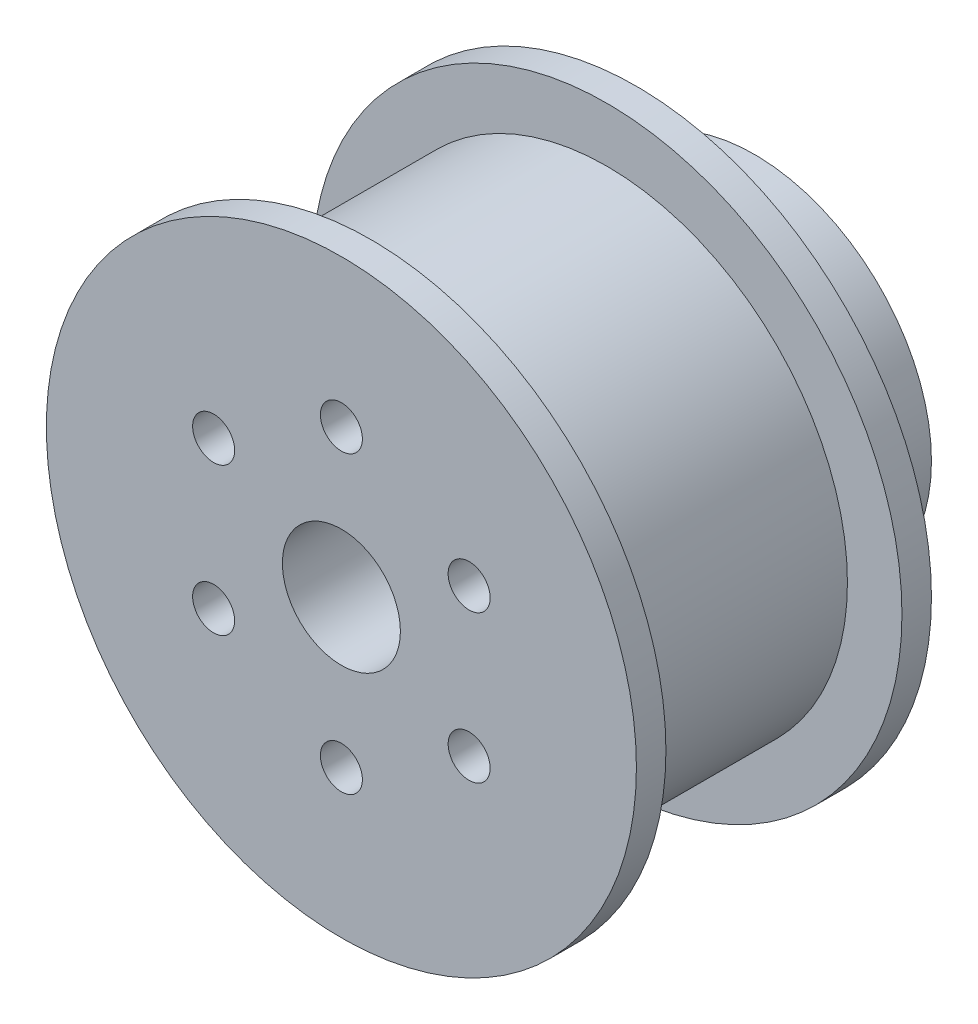
ISO-10303-21;
HEADER;
FILE_DESCRIPTION(('STEP AP214'),'2;1');
FILE_NAME('part.step','',(''),(''),'','','');
FILE_SCHEMA(('AUTOMOTIVE_DESIGN { 1 0 10303 214 1 1 1 1 }'));
ENDSEC;
DATA;
#1=APPLICATION_CONTEXT('core data for automotive mechanical design processes');
#2=APPLICATION_PROTOCOL_DEFINITION('international standard','automotive_design',2000,#1);
#3=PRODUCT_CONTEXT('',#1,'mechanical');
#4=PRODUCT('Part','Part','',(#3));
#5=PRODUCT_RELATED_PRODUCT_CATEGORY('part','',(#4));
#6=PRODUCT_DEFINITION_FORMATION('','',#4);
#7=PRODUCT_DEFINITION_CONTEXT('part definition',#1,'design');
#8=PRODUCT_DEFINITION('design','',#6,#7);
#9=PRODUCT_DEFINITION_SHAPE('','',#8);
#10=(LENGTH_UNIT() NAMED_UNIT(*) SI_UNIT(.MILLI.,.METRE.));
#11=(NAMED_UNIT(*) PLANE_ANGLE_UNIT() SI_UNIT($,.RADIAN.));
#12=(NAMED_UNIT(*) SI_UNIT($,.STERADIAN.) SOLID_ANGLE_UNIT());
#13=UNCERTAINTY_MEASURE_WITH_UNIT(LENGTH_MEASURE(1.E-05),#10,'distance_accuracy_value','');
#14=(GEOMETRIC_REPRESENTATION_CONTEXT(3) GLOBAL_UNCERTAINTY_ASSIGNED_CONTEXT((#13)) GLOBAL_UNIT_ASSIGNED_CONTEXT((#10,
#11,#12)) REPRESENTATION_CONTEXT('',''));
#15=CARTESIAN_POINT('',(0.,0.,0.));
#16=DIRECTION('',(0.,0.,1.));
#17=DIRECTION('',(1.,0.,0.));
#18=AXIS2_PLACEMENT_3D('',#15,#16,#17);
#19=CARTESIAN_POINT('',(0.,0.,0.));
#20=DIRECTION('',(0.,0.,-1.));
#21=DIRECTION('',(1.,0.,0.));
#22=AXIS2_PLACEMENT_3D('',#19,#20,#21);
#23=CYLINDRICAL_SURFACE('',#22,9.525);
#24=CARTESIAN_POINT('',(0.,9.525,2.04470000000001));
#25=CARTESIAN_POINT('',(-0.0632509375219131,9.52499915479188,2.04470270245697));
#26=CARTESIAN_POINT('',(-0.126542029749757,9.5243633064193,2.0500271232438));
#27=CARTESIAN_POINT('',(-0.251364820472078,9.52188793721448,2.07118424036684));
#28=CARTESIAN_POINT('',(-0.312894581904219,9.52004714057458,2.08702807498671));
#29=CARTESIAN_POINT('',(-0.432369436874992,9.51536936505536,2.12875218330424));
#30=CARTESIAN_POINT('',(-0.49031684700516,9.51253303804938,2.1546258905958));
#31=CARTESIAN_POINT('',(-0.601035404846345,9.506180121912,2.2156613468546));
#32=CARTESIAN_POINT('',(-0.653807476710619,9.50266365456691,2.25082143340901));
#33=CARTESIAN_POINT('',(-0.75295182295395,9.49532382723018,2.32961909895453));
#34=CARTESIAN_POINT('',(-0.799294604149035,9.49149917244225,2.37329366976166));
#35=CARTESIAN_POINT('',(-0.884010990406446,9.48398454417843,2.46780121878827));
#36=CARTESIAN_POINT('',(-0.922384200022101,9.48029457739318,2.5186345520125));
#37=CARTESIAN_POINT('',(-0.990180703567408,9.47345427413314,2.62620658516361));
#38=CARTESIAN_POINT('',(-1.01957659957805,9.47030560217059,2.68296266738078));
#39=CARTESIAN_POINT('',(-1.06840907808638,9.46492124661159,2.80064933068694));
#40=CARTESIAN_POINT('',(-1.08784600183097,9.46268553173297,2.86157976865938));
#41=CARTESIAN_POINT('',(-1.1161197035534,9.45939245018979,2.98558067429048));
#42=CARTESIAN_POINT('',(-1.12500607633105,9.45832957207026,3.04863968484435));
#43=CARTESIAN_POINT('',(-1.13207984575786,9.45748558744171,3.17536229799693));
#44=CARTESIAN_POINT('',(-1.13026763163491,9.45770443430195,3.23902587851649));
#45=CARTESIAN_POINT('',(-1.11603642445577,9.45939413033264,3.36480585863814));
#46=CARTESIAN_POINT('',(-1.10367192939602,9.4608585465419,3.42692852300703));
#47=CARTESIAN_POINT('',(-1.06877210956582,9.46486434331535,3.54821086751916));
#48=CARTESIAN_POINT('',(-1.04623659739191,9.4674057437232,3.6073704930454));
#49=CARTESIAN_POINT('',(-0.991575435750873,9.47328648500057,3.72121752193824));
#50=CARTESIAN_POINT('',(-0.959425968133554,9.47662780348318,3.77589338322514));
#51=CARTESIAN_POINT('',(-0.886466559501061,9.48373033604865,3.87909440846158));
#52=CARTESIAN_POINT('',(-0.845656261347889,9.48749156744401,3.92761931863866));
#53=CARTESIAN_POINT('',(-0.756230970668207,9.49503875161689,4.01745742183581));
#54=CARTESIAN_POINT('',(-0.707568978368593,9.49882471254411,4.05872384478604));
#55=CARTESIAN_POINT('',(-0.603983835638156,9.5059728190733,4.13250986554822));
#56=CARTESIAN_POINT('',(-0.549060673090109,9.50933496385503,4.16502944643204));
#57=CARTESIAN_POINT('',(-0.434477192227891,9.51525841591306,4.22039818128805));
#58=CARTESIAN_POINT('',(-0.37481551982548,9.51781949323438,4.24324455912828));
#59=CARTESIAN_POINT('',(-0.252465658532567,9.52185010274536,4.27858201850423));
#60=CARTESIAN_POINT('',(-0.18977759738165,9.52331968096283,4.29107353670023));
#61=CARTESIAN_POINT('',(-0.0635590107666499,9.52499574893122,4.30528642309018));
#62=CARTESIAN_POINT('',(-3.58400083123205E-05,9.52520979797053,4.30707224953617));
#63=CARTESIAN_POINT('',(0.126404631849714,9.5243710616825,4.29999294412866));
#64=CARTESIAN_POINT('',(0.189321944527945,9.52331830061377,4.29112801623034));
#65=CARTESIAN_POINT('',(0.312575650423429,9.52006897220777,4.26305237506707));
#66=CARTESIAN_POINT('',(0.372919106821373,9.51787578670261,4.24387224492876));
#67=CARTESIAN_POINT('',(0.489532754276605,9.51259128030109,4.19574234807837));
#68=CARTESIAN_POINT('',(0.545802819522162,9.50949993167863,4.16679227976586));
#69=CARTESIAN_POINT('',(0.652961239170924,9.50274519697551,4.09978727203576));
#70=CARTESIAN_POINT('',(0.703823242482478,9.49907920769755,4.06169045722993));
#71=CARTESIAN_POINT('',(0.798454027403533,9.49159384532421,3.97753284488347));
#72=CARTESIAN_POINT('',(0.842222556073248,9.48777446676533,3.93147176347326));
#73=CARTESIAN_POINT('',(0.921651327981493,9.48038962493189,3.83240990885744));
#74=CARTESIAN_POINT('',(0.957268957312501,9.47682556018668,3.77937484808917));
#75=CARTESIAN_POINT('',(1.01909088187736,9.47037744686408,3.66803762953532));
#76=CARTESIAN_POINT('',(1.04529534989561,9.46749338580514,3.60973556845337));
#77=CARTESIAN_POINT('',(1.08747746493127,9.46274116392142,3.48965919026062));
#78=CARTESIAN_POINT('',(1.10347950086257,9.46087058199655,3.42789354070565));
#79=CARTESIAN_POINT('',(1.12488122562179,9.45835002776142,3.30252837334878));
#80=CARTESIAN_POINT('',(1.13028135522926,9.45770000470587,3.23892893189927));
#81=CARTESIAN_POINT('',(1.1303184331302,9.45769553968786,3.11212535749611));
#82=CARTESIAN_POINT('',(1.12502232452988,9.45833303967828,3.04892123389645));
#83=CARTESIAN_POINT('',(1.10395863981905,9.46081450631757,2.92430798622455));
#84=CARTESIAN_POINT('',(1.08819105929352,9.46265847347512,2.86289886290915));
#85=CARTESIAN_POINT('',(1.04665229311139,9.4673426850713,2.74362536688638));
#86=CARTESIAN_POINT('',(1.02088399489125,9.4701826419221,2.68575997660022));
#87=CARTESIAN_POINT('',(0.960081888687952,9.47653934827966,2.57516402600584));
#88=CARTESIAN_POINT('',(0.925048010140116,9.48005610294073,2.52243350480786));
#89=CARTESIAN_POINT('',(0.846459876445609,9.4873965412942,2.42326157372525));
#90=CARTESIAN_POINT('',(0.802855698093828,9.49122194198921,2.37685984993572));
#91=CARTESIAN_POINT('',(0.70846795098953,9.49873331929354,2.29200565583022));
#92=CARTESIAN_POINT('',(0.657682685184867,9.50241926268422,2.25355506985088));
#93=CARTESIAN_POINT('',(0.550175875241665,9.50925025151029,2.18558383753544));
#94=CARTESIAN_POINT('',(0.493434507280822,9.51239339223359,2.1560943717792));
#95=CARTESIAN_POINT('',(0.375800731512535,9.51776504462355,2.10710365534466));
#96=CARTESIAN_POINT('',(0.314912964671015,9.51999455988771,2.08759143900469));
#97=CARTESIAN_POINT('',(0.21141811479381,9.5227440281588,2.06383345788656));
#98=CARTESIAN_POINT('',(0.169466299617015,9.52358594491639,2.05666858193351));
#99=CARTESIAN_POINT('',(0.0850157018599232,9.524714213129,2.04710095996014));
#100=CARTESIAN_POINT('',(0.0425169227863941,9.52500056814412,2.0446981834237));
#101=CARTESIAN_POINT('',(0.,9.525,2.04470000000001));
#102=B_SPLINE_CURVE_WITH_KNOTS('',3,(#24,#25,#26,#27,#28,#29,#30,#31,#32,#33,#34,#35,#36,#37,
#38,#39,#40,#41,#42,#43,#44,#45,#46,#47,#48,#49,#50,#51,#52,#53,#54,#55,#56,#57,#58,#59,#60,#61,
#62,#63,#64,#65,#66,#67,#68,#69,#70,#71,#72,#73,#74,#75,#76,#77,#78,#79,#80,#81,#82,#83,#84,#85,
#86,#87,#88,#89,#90,#91,#92,#93,#94,#95,#96,#97,#98,#99,#100,#101),.UNSPECIFIED.,.T.,.F.,(4,2,2,
2,2,2,2,2,2,2,2,2,2,2,2,2,2,2,2,2,2,2,2,2,2,2,2,2,2,2,2,2,2,2,2,2,2,2,4),(0.,0.189597524312163,
0.379396121234883,0.569070669169938,0.758711285265448,0.949194948105548,1.13968806040505,
1.33075686013228,1.52181911239724,1.71197964005891,1.90213324948718,2.09131069927981,
2.28049163485501,2.4701451964838,2.65980658018673,2.8506485273792,3.04149084391374,
3.232387893604,3.4232768928326,3.61301539850875,3.80275027087081,3.99192568241037,
4.18110693437604,4.37117138460746,4.56124261068453,4.75228593782411,4.94332575806604,
5.13390716820241,5.32448065465381,5.51386512071868,5.70324966663245,5.89257957351563,
6.08191092233625,6.27237971236643,6.4628935899097,6.65406297150348,6.8450217911509,
6.97246899232318,7.09991537679581),.UNSPECIFIED.);
#103=CARTESIAN_POINT('',(0.,9.525,2.04470000000001));
#104=VERTEX_POINT('',#103);
#105=EDGE_CURVE('E85',#104,#104,#102,.T.);
#106=ORIENTED_EDGE('',*,*,#105,.F.);
#107=EDGE_LOOP('',(#106));
#108=FACE_BOUND('',#107,.T.);
#109=CARTESIAN_POINT('',(0.,0.,0.));
#110=DIRECTION('',(0.,0.,1.));
#111=DIRECTION('',(1.,0.,0.));
#112=AXIS2_PLACEMENT_3D('',#109,#110,#111);
#113=CIRCLE('',#112,9.525);
#114=CARTESIAN_POINT('',(9.525,0.,0.));
#115=VERTEX_POINT('',#114);
#116=EDGE_CURVE('E11',#115,#115,#113,.T.);
#117=ORIENTED_EDGE('',*,*,#116,.T.);
#118=EDGE_LOOP('',(#117));
#119=FACE_BOUND('',#118,.T.);
#120=CARTESIAN_POINT('',(0.,0.,6.35));
#121=DIRECTION('',(0.,0.,1.));
#122=DIRECTION('',(1.,0.,0.));
#123=AXIS2_PLACEMENT_3D('',#120,#121,#122);
#124=CIRCLE('',#123,9.525);
#125=CARTESIAN_POINT('',(9.525,0.,6.35));
#126=VERTEX_POINT('',#125);
#127=EDGE_CURVE('E115',#126,#126,#124,.T.);
#128=ORIENTED_EDGE('',*,*,#127,.F.);
#129=EDGE_LOOP('',(#128));
#130=FACE_BOUND('',#129,.T.);
#131=ADVANCED_FACE('F41',(#108,#119,#130),#23,.T.);
#132=CARTESIAN_POINT('',(0.,9.525,0.));
#133=DIRECTION('',(0.,0.,1.));
#134=DIRECTION('',(-1.,0.,0.));
#135=AXIS2_PLACEMENT_3D('',#132,#133,#134);
#136=PLANE('',#135);
#137=CARTESIAN_POINT('',(0.,0.,0.));
#138=DIRECTION('',(0.,0.,1.));
#139=DIRECTION('',(1.,0.,0.));
#140=AXIS2_PLACEMENT_3D('',#137,#138,#139);
#141=CIRCLE('',#140,3.175);
#142=CARTESIAN_POINT('',(3.175,0.,0.));
#143=VERTEX_POINT('',#142);
#144=EDGE_CURVE('E49',#143,#143,#141,.T.);
#145=ORIENTED_EDGE('',*,*,#144,.T.);
#146=EDGE_LOOP('',(#145));
#147=FACE_BOUND('',#146,.T.);
#148=ORIENTED_EDGE('',*,*,#116,.F.);
#149=EDGE_LOOP('',(#148));
#150=FACE_BOUND('',#149,.T.);
#151=ADVANCED_FACE('F141',(#147,#150),#136,.F.);
#152=CARTESIAN_POINT('',(0.,0.,0.));
#153=DIRECTION('',(0.,0.,-1.));
#154=DIRECTION('',(1.,0.,0.));
#155=AXIS2_PLACEMENT_3D('',#152,#153,#154);
#156=CYLINDRICAL_SURFACE('',#155,3.175);
#157=CARTESIAN_POINT('',(0.,3.175,2.04470000000001));
#158=CARTESIAN_POINT('',(0.0614285544766775,3.17500087649076,2.04469877624258));
#159=CARTESIAN_POINT('',(0.122848391480887,3.17320130070143,2.04972367898314));
#160=CARTESIAN_POINT('',(0.243864611742384,3.1662010034201,2.06961858543575));
#161=CARTESIAN_POINT('',(0.303461052111786,3.16100038856924,2.08448828045996));
#162=CARTESIAN_POINT('',(0.419068309151045,3.14775949893737,2.12348844997215));
#163=CARTESIAN_POINT('',(0.475085403185974,3.13972436624609,2.14760216174167));
#164=CARTESIAN_POINT('',(0.582278041616503,3.12162393487057,2.20432504012241));
#165=CARTESIAN_POINT('',(0.63345243149865,3.11155815385673,2.23693622563318));
#166=CARTESIAN_POINT('',(0.731495005230027,3.09000790855595,2.31105507992649));
#167=CARTESIAN_POINT('',(0.778149616243894,3.07848610582585,2.35283431689856));
#168=CARTESIAN_POINT('',(0.863958107942655,3.055516031792,2.44352654130838));
#169=CARTESIAN_POINT('',(0.903110009958687,3.04406778065305,2.49244140463129));
#170=CARTESIAN_POINT('',(0.974093633832353,3.02211785986225,2.59802569017699));
#171=CARTESIAN_POINT('',(1.00563502809096,3.01166094904186,2.65490051833327));
#172=CARTESIAN_POINT('',(1.05861134705909,2.99345244738711,2.77357939759986));
#173=CARTESIAN_POINT('',(1.08004985661479,2.98569989720789,2.8353816911635));
#174=CARTESIAN_POINT('',(1.11138819305282,2.9741742173714,2.9597149448491));
#175=CARTESIAN_POINT('',(1.12169236541681,2.97026214805179,3.0221306997839));
#176=CARTESIAN_POINT('',(1.13173392893204,2.96645158379256,3.14791847859527));
#177=CARTESIAN_POINT('',(1.13147514856466,2.96655163468287,3.21129014768161));
#178=CARTESIAN_POINT('',(1.12070953557278,2.97063328242024,3.3336133661018));
#179=CARTESIAN_POINT('',(1.11074743190181,2.9744085523292,3.39262097911382));
#180=CARTESIAN_POINT('',(1.08175290027524,2.98507483987672,3.50806464240935));
#181=CARTESIAN_POINT('',(1.06271924100947,2.99196628047622,3.56450034245956));
#182=CARTESIAN_POINT('',(1.01579639288465,3.00822311818093,3.67436762329595));
#183=CARTESIAN_POINT('',(0.98775662564137,3.01763009039322,3.72772847353732));
#184=CARTESIAN_POINT('',(0.923722187948481,3.03784253722577,3.82915226072601));
#185=CARTESIAN_POINT('',(0.887724971743376,3.04864845893998,3.87721349482272));
#186=CARTESIAN_POINT('',(0.806247147627662,3.0712342285018,3.96971122491127));
#187=CARTESIAN_POINT('',(0.760326653485437,3.08303358094073,4.01375635543315));
#188=CARTESIAN_POINT('',(0.661610098844965,3.10571393948941,4.09363040690295));
#189=CARTESIAN_POINT('',(0.608813181467748,3.11659483086972,4.12945830235303));
#190=CARTESIAN_POINT('',(0.496923650490418,3.13639217173446,4.19225643876642));
#191=CARTESIAN_POINT('',(0.437759573781156,3.14528190725224,4.21910836273788));
#192=CARTESIAN_POINT('',(0.31535998984196,3.15989936928577,4.2623520019204));
#193=CARTESIAN_POINT('',(0.252126116160288,3.16562835574328,4.27874788553834));
#194=CARTESIAN_POINT('',(0.126684885961714,3.17306329879329,4.29988948929031));
#195=CARTESIAN_POINT('',(0.0645771816882159,3.17495136824996,4.30516304433809));
#196=CARTESIAN_POINT('',(-0.0596565359676966,3.17504672531149,4.30543160042332));
#197=CARTESIAN_POINT('',(-0.121782543364872,3.1732547352019,4.30042861843736));
#198=CARTESIAN_POINT('',(-0.2420876895595,3.16631168752833,4.28069555255756));
#199=CARTESIAN_POINT('',(-0.300329231110409,3.16127656517542,4.26630097687732));
#200=CARTESIAN_POINT('',(-0.413538192846497,3.14846933320479,4.22862458392996));
#201=CARTESIAN_POINT('',(-0.468505187040125,3.14069686838655,4.20534161326216));
#202=CARTESIAN_POINT('',(-0.575332725471089,3.12292068057346,4.14983109763225));
#203=CARTESIAN_POINT('',(-0.62706241789348,3.11286035066926,4.11737039982098));
#204=CARTESIAN_POINT('',(-0.724505279210258,3.09163517782237,4.04469392625775));
#205=CARTESIAN_POINT('',(-0.770216385550679,3.08046995852105,4.00447550353221));
#206=CARTESIAN_POINT('',(-0.856811848575496,3.05754963314883,3.91495158635895));
#207=CARTESIAN_POINT('',(-0.897320261231916,3.0457941243994,3.86528162488484));
#208=CARTESIAN_POINT('',(-0.96948829647317,3.02359841598846,3.75960588734371));
#209=CARTESIAN_POINT('',(-1.00114750732455,3.01315827754059,3.70359981664202));
#210=CARTESIAN_POINT('',(-1.05465477079429,2.99485112677041,3.58660726309193));
#211=CARTESIAN_POINT('',(-1.07649405053023,2.98698641696941,3.52561638418745));
#212=CARTESIAN_POINT('',(-1.10946944902859,2.97489781303426,3.40047036605966));
#213=CARTESIAN_POINT('',(-1.12061131703489,2.97067196334806,3.33631694603455));
#214=CARTESIAN_POINT('',(-1.13139068963521,2.96658222044346,3.21069434395218));
#215=CARTESIAN_POINT('',(-1.13166111008652,2.9664783574786,3.14928675952382));
#216=CARTESIAN_POINT('',(-1.12228164306422,2.97003931415379,3.02735111764559));
#217=CARTESIAN_POINT('',(-1.1126325176599,2.97370384428697,2.96682299299347));
#218=CARTESIAN_POINT('',(-1.08416089230554,2.98419839475886,2.84987294880746));
#219=CARTESIAN_POINT('',(-1.06557142470546,2.9909477964968,2.79338646868559));
#220=CARTESIAN_POINT('',(-1.01994372799953,3.0068123311106,2.68429540767603));
#221=CARTESIAN_POINT('',(-0.992903472899541,3.01592803119462,2.63169176140234));
#222=CARTESIAN_POINT('',(-0.929616151238455,3.03604854272464,2.52909051132457));
#223=CARTESIAN_POINT('',(-0.892986233526769,3.0471235224069,2.4793429511517));
#224=CARTESIAN_POINT('',(-0.812177154252531,3.06964995874745,2.38649729256409));
#225=CARTESIAN_POINT('',(-0.767995717285472,3.08110152803636,2.34340120582446));
#226=CARTESIAN_POINT('',(-0.670861718733724,3.10373428576573,2.26303642120086));
#227=CARTESIAN_POINT('',(-0.617595515492274,3.11487776157142,2.22613466782598));
#228=CARTESIAN_POINT('',(-0.505234578584043,3.13506244460878,2.16183451178947));
#229=CARTESIAN_POINT('',(-0.446140340356561,3.14410383031939,2.13443530221262));
#230=CARTESIAN_POINT('',(-0.323645197027847,3.15906443826106,2.09006649917454));
#231=CARTESIAN_POINT('',(-0.260236860921374,3.16497811106267,2.07311543486654));
#232=CARTESIAN_POINT('',(-0.13121513161262,3.17294468299437,2.05043499228508));
#233=CARTESIAN_POINT('',(-0.0656025945972242,3.17499906395212,2.04470130691115));
#234=CARTESIAN_POINT('',(0.,3.175,2.04470000000001));
#235=B_SPLINE_CURVE_WITH_KNOTS('',3,(#157,#158,#159,#160,#161,#162,#163,#164,#165,#166,#167,
#168,#169,#170,#171,#172,#173,#174,#175,#176,#177,#178,#179,#180,#181,#182,#183,#184,#185,#186,
#187,#188,#189,#190,#191,#192,#193,#194,#195,#196,#197,#198,#199,#200,#201,#202,#203,#204,#205,
#206,#207,#208,#209,#210,#211,#212,#213,#214,#215,#216,#217,#218,#219,#220,#221,#222,#223,#224,
#225,#226,#227,#228,#229,#230,#231,#232,#233,#234),.UNSPECIFIED.,.T.,.F.,(4,2,2,2,2,2,2,2,2,2,2,
2,2,2,2,2,2,2,2,2,2,2,2,2,2,2,2,2,2,2,2,2,2,2,2,2,2,2,4),(0.,0.184043941459559,
0.368082112412804,0.55178812280708,0.735537819443362,0.925722644883201,1.11595755842548,
1.31258758821647,1.50914779437034,1.69830149435246,1.88738663727475,2.0664345293368,
2.24550673104464,2.42774410221585,2.61003985955345,2.80329006106036,2.99656436677722,
3.19229416831943,3.38794589132548,3.57408187032766,3.76018131989989,3.93997181359126,
4.11978564569257,4.30465683345394,4.48959121210527,4.68416822385534,4.87875428732968,
5.07351384543876,5.26816867279114,5.45147357003616,5.63476438593101,5.81351722268546,
5.99231294661073,6.17977826003498,6.36730015993199,6.56359488860402,6.75987294468711,
6.95649809396628,7.15304773089825),.UNSPECIFIED.);
#236=CARTESIAN_POINT('',(0.,3.175,2.04470000000001));
#237=VERTEX_POINT('',#236);
#238=EDGE_CURVE('E253',#237,#237,#235,.T.);
#239=ORIENTED_EDGE('',*,*,#238,.F.);
#240=EDGE_LOOP('',(#239));
#241=FACE_BOUND('',#240,.T.);
#242=CARTESIAN_POINT('',(0.,0.,22.225));
#243=DIRECTION('',(0.,0.,1.));
#244=DIRECTION('',(1.,0.,0.));
#245=AXIS2_PLACEMENT_3D('',#242,#243,#244);
#246=CIRCLE('',#245,3.175);
#247=CARTESIAN_POINT('',(3.175,0.,22.225));
#248=VERTEX_POINT('',#247);
#249=EDGE_CURVE('E136',#248,#248,#246,.T.);
#250=ORIENTED_EDGE('',*,*,#249,.T.);
#251=EDGE_LOOP('',(#250));
#252=FACE_BOUND('',#251,.T.);
#253=ORIENTED_EDGE('',*,*,#144,.F.);
#254=EDGE_LOOP('',(#253));
#255=FACE_BOUND('',#254,.T.);
#256=ADVANCED_FACE('F144',(#241,#252,#255),#156,.F.);
#257=CARTESIAN_POINT('',(0.,15.875,22.225));
#258=DIRECTION('',(0.,0.,-1.));
#259=DIRECTION('',(1.,0.,0.));
#260=AXIS2_PLACEMENT_3D('',#257,#258,#259);
#261=PLANE('',#260);
#262=CARTESIAN_POINT('',(0.,7.9375,22.225));
#263=DIRECTION('',(0.,0.,-1.));
#264=DIRECTION('',(-1.,0.,0.));
#265=AXIS2_PLACEMENT_3D('',#262,#263,#264);
#266=CIRCLE('',#265,1.1303);
#267=CARTESIAN_POINT('',(-1.1303,7.9375,22.225));
#268=VERTEX_POINT('',#267);
#269=EDGE_CURVE('E79',#268,#268,#266,.T.);
#270=ORIENTED_EDGE('',*,*,#269,.T.);
#271=EDGE_LOOP('',(#270));
#272=FACE_BOUND('',#271,.T.);
#273=CARTESIAN_POINT('',(-6.87407664253921,3.96875000000039,22.225));
#274=DIRECTION('',(0.,0.,-1.));
#275=DIRECTION('',(-1.,0.,0.));
#276=AXIS2_PLACEMENT_3D('',#273,#274,#275);
#277=CIRCLE('',#276,1.1303);
#278=CARTESIAN_POINT('',(-8.00437664253921,3.96875000000039,22.225));
#279=VERTEX_POINT('',#278);
#280=EDGE_CURVE('E78',#279,#279,#277,.T.);
#281=ORIENTED_EDGE('',*,*,#280,.T.);
#282=EDGE_LOOP('',(#281));
#283=FACE_BOUND('',#282,.T.);
#284=CARTESIAN_POINT('',(-6.87407664253966,-3.96874999999961,22.225));
#285=DIRECTION('',(0.,0.,-1.));
#286=DIRECTION('',(-1.,0.,0.));
#287=AXIS2_PLACEMENT_3D('',#284,#285,#286);
#288=CIRCLE('',#287,1.1303);
#289=CARTESIAN_POINT('',(-8.00437664253966,-3.96874999999961,22.225));
#290=VERTEX_POINT('',#289);
#291=EDGE_CURVE('E91',#290,#290,#288,.T.);
#292=ORIENTED_EDGE('',*,*,#291,.T.);
#293=EDGE_LOOP('',(#292));
#294=FACE_BOUND('',#293,.T.);
#295=CARTESIAN_POINT('',(-9.00445147621681E-13,-7.9375,22.225));
#296=DIRECTION('',(0.,0.,-1.));
#297=DIRECTION('',(-1.,0.,0.));
#298=AXIS2_PLACEMENT_3D('',#295,#296,#297);
#299=CIRCLE('',#298,1.1303);
#300=CARTESIAN_POINT('',(-1.1303000000009,-7.9375,22.225));
#301=VERTEX_POINT('',#300);
#302=EDGE_CURVE('E97',#301,#301,#299,.T.);
#303=ORIENTED_EDGE('',*,*,#302,.T.);
#304=EDGE_LOOP('',(#303));
#305=FACE_BOUND('',#304,.T.);
#306=CARTESIAN_POINT('',(6.8740766425383,-3.96875000000039,22.225));
#307=DIRECTION('',(0.,0.,-1.));
#308=DIRECTION('',(-1.,0.,0.));
#309=AXIS2_PLACEMENT_3D('',#306,#307,#308);
#310=CIRCLE('',#309,1.1303);
#311=CARTESIAN_POINT('',(5.7437766425383,-3.96875000000039,22.225));
#312=VERTEX_POINT('',#311);
#313=EDGE_CURVE('E103',#312,#312,#310,.T.);
#314=ORIENTED_EDGE('',*,*,#313,.T.);
#315=EDGE_LOOP('',(#314));
#316=FACE_BOUND('',#315,.T.);
#317=CARTESIAN_POINT('',(6.87407664253876,3.96874999999961,22.225));
#318=DIRECTION('',(0.,0.,-1.));
#319=DIRECTION('',(-1.,0.,0.));
#320=AXIS2_PLACEMENT_3D('',#317,#318,#319);
#321=CIRCLE('',#320,1.1303);
#322=CARTESIAN_POINT('',(5.74377664253876,3.96874999999961,22.225));
#323=VERTEX_POINT('',#322);
#324=EDGE_CURVE('E109',#323,#323,#321,.T.);
#325=ORIENTED_EDGE('',*,*,#324,.T.);
#326=EDGE_LOOP('',(#325));
#327=FACE_BOUND('',#326,.T.);
#328=CARTESIAN_POINT('',(0.,0.,22.225));
#329=DIRECTION('',(0.,0.,1.));
#330=DIRECTION('',(1.,0.,0.));
#331=AXIS2_PLACEMENT_3D('',#328,#329,#330);
#332=CIRCLE('',#331,15.875);
#333=CARTESIAN_POINT('',(15.875,0.,22.225));
#334=VERTEX_POINT('',#333);
#335=EDGE_CURVE('E133',#334,#334,#332,.T.);
#336=ORIENTED_EDGE('',*,*,#335,.T.);
#337=EDGE_LOOP('',(#336));
#338=FACE_BOUND('',#337,.T.);
#339=ORIENTED_EDGE('',*,*,#249,.F.);
#340=EDGE_LOOP('',(#339));
#341=FACE_BOUND('',#340,.T.);
#342=ADVANCED_FACE('F146',(#272,#283,#294,#305,#316,#327,#338,#341),#261,.F.);
#343=CARTESIAN_POINT('',(0.,0.,0.));
#344=DIRECTION('',(0.,0.,-1.));
#345=DIRECTION('',(1.,0.,0.));
#346=AXIS2_PLACEMENT_3D('',#343,#344,#345);
#347=CYLINDRICAL_SURFACE('',#346,15.875);
#348=CARTESIAN_POINT('',(0.,0.,20.6375));
#349=DIRECTION('',(0.,0.,1.));
#350=DIRECTION('',(1.,0.,0.));
#351=AXIS2_PLACEMENT_3D('',#348,#349,#350);
#352=CIRCLE('',#351,15.875);
#353=CARTESIAN_POINT('',(15.875,0.,20.6375));
#354=VERTEX_POINT('',#353);
#355=EDGE_CURVE('E130',#354,#354,#352,.T.);
#356=ORIENTED_EDGE('',*,*,#355,.T.);
#357=EDGE_LOOP('',(#356));
#358=FACE_BOUND('',#357,.T.);
#359=ORIENTED_EDGE('',*,*,#335,.F.);
#360=EDGE_LOOP('',(#359));
#361=FACE_BOUND('',#360,.T.);
#362=ADVANCED_FACE('F153',(#358,#361),#347,.T.);
#363=CARTESIAN_POINT('',(0.,12.9413,20.6375));
#364=DIRECTION('',(0.,0.,1.));
#365=DIRECTION('',(-1.,0.,0.));
#366=AXIS2_PLACEMENT_3D('',#363,#364,#365);
#367=PLANE('',#366);
#368=CARTESIAN_POINT('',(0.,0.,20.6375));
#369=DIRECTION('',(0.,0.,1.));
#370=DIRECTION('',(1.,0.,0.));
#371=AXIS2_PLACEMENT_3D('',#368,#369,#370);
#372=CIRCLE('',#371,12.9413);
#373=CARTESIAN_POINT('',(12.9413,0.,20.6375));
#374=VERTEX_POINT('',#373);
#375=EDGE_CURVE('E127',#374,#374,#372,.T.);
#376=ORIENTED_EDGE('',*,*,#375,.T.);
#377=EDGE_LOOP('',(#376));
#378=FACE_BOUND('',#377,.T.);
#379=ORIENTED_EDGE('',*,*,#355,.F.);
#380=EDGE_LOOP('',(#379));
#381=FACE_BOUND('',#380,.T.);
#382=ADVANCED_FACE('F191',(#378,#381),#367,.F.);
#383=CARTESIAN_POINT('',(0.,0.,0.));
#384=DIRECTION('',(0.,0.,-1.));
#385=DIRECTION('',(1.,0.,0.));
#386=AXIS2_PLACEMENT_3D('',#383,#384,#385);
#387=CYLINDRICAL_SURFACE('',#386,12.9413);
#388=CARTESIAN_POINT('',(0.,0.,7.9375));
#389=DIRECTION('',(0.,0.,1.));
#390=DIRECTION('',(1.,0.,0.));
#391=AXIS2_PLACEMENT_3D('',#388,#389,#390);
#392=CIRCLE('',#391,12.9413);
#393=CARTESIAN_POINT('',(12.9413,0.,7.9375));
#394=VERTEX_POINT('',#393);
#395=EDGE_CURVE('E124',#394,#394,#392,.T.);
#396=ORIENTED_EDGE('',*,*,#395,.T.);
#397=EDGE_LOOP('',(#396));
#398=FACE_BOUND('',#397,.T.);
#399=ORIENTED_EDGE('',*,*,#375,.F.);
#400=EDGE_LOOP('',(#399));
#401=FACE_BOUND('',#400,.T.);
#402=ADVANCED_FACE('F185',(#398,#401),#387,.T.);
#403=CARTESIAN_POINT('',(0.,15.875,7.9375));
#404=DIRECTION('',(0.,0.,-1.));
#405=DIRECTION('',(1.,0.,0.));
#406=AXIS2_PLACEMENT_3D('',#403,#404,#405);
#407=PLANE('',#406);
#408=CARTESIAN_POINT('',(0.,0.,7.9375));
#409=DIRECTION('',(0.,0.,1.));
#410=DIRECTION('',(1.,0.,0.));
#411=AXIS2_PLACEMENT_3D('',#408,#409,#410);
#412=CIRCLE('',#411,15.875);
#413=CARTESIAN_POINT('',(15.875,0.,7.9375));
#414=VERTEX_POINT('',#413);
#415=EDGE_CURVE('E121',#414,#414,#412,.T.);
#416=ORIENTED_EDGE('',*,*,#415,.T.);
#417=EDGE_LOOP('',(#416));
#418=FACE_BOUND('',#417,.T.);
#419=ORIENTED_EDGE('',*,*,#395,.F.);
#420=EDGE_LOOP('',(#419));
#421=FACE_BOUND('',#420,.T.);
#422=ADVANCED_FACE('F179',(#418,#421),#407,.F.);
#423=CARTESIAN_POINT('',(0.,0.,0.));
#424=DIRECTION('',(0.,0.,-1.));
#425=DIRECTION('',(1.,0.,0.));
#426=AXIS2_PLACEMENT_3D('',#423,#424,#425);
#427=CYLINDRICAL_SURFACE('',#426,15.875);
#428=CARTESIAN_POINT('',(0.,0.,6.35));
#429=DIRECTION('',(0.,0.,1.));
#430=DIRECTION('',(1.,0.,0.));
#431=AXIS2_PLACEMENT_3D('',#428,#429,#430);
#432=CIRCLE('',#431,15.875);
#433=CARTESIAN_POINT('',(15.875,0.,6.35));
#434=VERTEX_POINT('',#433);
#435=EDGE_CURVE('E118',#434,#434,#432,.T.);
#436=ORIENTED_EDGE('',*,*,#435,.T.);
#437=EDGE_LOOP('',(#436));
#438=FACE_BOUND('',#437,.T.);
#439=ORIENTED_EDGE('',*,*,#415,.F.);
#440=EDGE_LOOP('',(#439));
#441=FACE_BOUND('',#440,.T.);
#442=ADVANCED_FACE('F173',(#438,#441),#427,.T.);
#443=CARTESIAN_POINT('',(0.,9.525,6.35));
#444=DIRECTION('',(0.,0.,1.));
#445=DIRECTION('',(-1.,0.,0.));
#446=AXIS2_PLACEMENT_3D('',#443,#444,#445);
#447=PLANE('',#446);
#448=ORIENTED_EDGE('',*,*,#127,.T.);
#449=EDGE_LOOP('',(#448));
#450=FACE_BOUND('',#449,.T.);
#451=ORIENTED_EDGE('',*,*,#435,.F.);
#452=EDGE_LOOP('',(#451));
#453=FACE_BOUND('',#452,.T.);
#454=ADVANCED_FACE('F169',(#450,#453),#447,.F.);
#455=CARTESIAN_POINT('',(6.87407664253876,3.96874999999961,13.335));
#456=DIRECTION('',(0.,0.,1.));
#457=DIRECTION('',(-1.,0.,0.));
#458=AXIS2_PLACEMENT_3D('',#455,#456,#457);
#459=CONICAL_SURFACE('',#458,1.1303,1.02974425867665);
#460=CARTESIAN_POINT('',(6.87407664253875,3.96874999999961,12.6558472423132));
#461=VERTEX_POINT('',#460);
#462=VERTEX_LOOP('',#461);
#463=FACE_BOUND('',#462,.T.);
#464=CARTESIAN_POINT('',(6.87407664253876,3.96874999999961,13.335));
#465=DIRECTION('',(0.,0.,-1.));
#466=DIRECTION('',(-1.,0.,0.));
#467=AXIS2_PLACEMENT_3D('',#464,#465,#466);
#468=CIRCLE('',#467,1.1303);
#469=CARTESIAN_POINT('',(5.74377664253876,3.96874999999961,13.335));
#470=VERTEX_POINT('',#469);
#471=EDGE_CURVE('E112',#470,#470,#468,.T.);
#472=ORIENTED_EDGE('',*,*,#471,.F.);
#473=EDGE_LOOP('',(#472));
#474=FACE_BOUND('',#473,.T.);
#475=ADVANCED_FACE('F172',(#463,#474),#459,.F.);
#476=CARTESIAN_POINT('',(6.87407664253876,3.96874999999961,22.225));
#477=DIRECTION('',(0.,0.,1.));
#478=DIRECTION('',(-1.,0.,0.));
#479=AXIS2_PLACEMENT_3D('',#476,#477,#478);
#480=CYLINDRICAL_SURFACE('',#479,1.1303);
#481=ORIENTED_EDGE('',*,*,#471,.T.);
#482=EDGE_LOOP('',(#481));
#483=FACE_BOUND('',#482,.T.);
#484=ORIENTED_EDGE('',*,*,#324,.F.);
#485=EDGE_LOOP('',(#484));
#486=FACE_BOUND('',#485,.T.);
#487=ADVANCED_FACE('F212',(#483,#486),#480,.F.);
#488=CARTESIAN_POINT('',(6.8740766425383,-3.96875000000039,13.335));
#489=DIRECTION('',(0.,0.,1.));
#490=DIRECTION('',(-1.,0.,0.));
#491=AXIS2_PLACEMENT_3D('',#488,#489,#490);
#492=CONICAL_SURFACE('',#491,1.1303,1.02974425867665);
#493=CARTESIAN_POINT('',(6.8740766425383,-3.96875000000039,12.6558472423132));
#494=VERTEX_POINT('',#493);
#495=VERTEX_LOOP('',#494);
#496=FACE_BOUND('',#495,.T.);
#497=CARTESIAN_POINT('',(6.8740766425383,-3.96875000000039,13.335));
#498=DIRECTION('',(0.,0.,-1.));
#499=DIRECTION('',(-1.,0.,0.));
#500=AXIS2_PLACEMENT_3D('',#497,#498,#499);
#501=CIRCLE('',#500,1.1303);
#502=CARTESIAN_POINT('',(5.74377664253831,-3.96875000000039,13.335));
#503=VERTEX_POINT('',#502);
#504=EDGE_CURVE('E106',#503,#503,#501,.T.);
#505=ORIENTED_EDGE('',*,*,#504,.F.);
#506=EDGE_LOOP('',(#505));
#507=FACE_BOUND('',#506,.T.);
#508=ADVANCED_FACE('F215',(#496,#507),#492,.F.);
#509=CARTESIAN_POINT('',(6.8740766425383,-3.96875000000039,22.225));
#510=DIRECTION('',(0.,0.,1.));
#511=DIRECTION('',(-1.,0.,0.));
#512=AXIS2_PLACEMENT_3D('',#509,#510,#511);
#513=CYLINDRICAL_SURFACE('',#512,1.1303);
#514=ORIENTED_EDGE('',*,*,#504,.T.);
#515=EDGE_LOOP('',(#514));
#516=FACE_BOUND('',#515,.T.);
#517=ORIENTED_EDGE('',*,*,#313,.F.);
#518=EDGE_LOOP('',(#517));
#519=FACE_BOUND('',#518,.T.);
#520=ADVANCED_FACE('F219',(#516,#519),#513,.F.);
#521=CARTESIAN_POINT('',(-9.00445147621681E-13,-7.9375,13.335));
#522=DIRECTION('',(0.,0.,1.));
#523=DIRECTION('',(-1.,0.,0.));
#524=AXIS2_PLACEMENT_3D('',#521,#522,#523);
#525=CONICAL_SURFACE('',#524,1.1303,1.02974425867665);
#526=CARTESIAN_POINT('',(-9.02788914080731E-13,-7.9375,12.6558472423132));
#527=VERTEX_POINT('',#526);
#528=VERTEX_LOOP('',#527);
#529=FACE_BOUND('',#528,.T.);
#530=CARTESIAN_POINT('',(-9.00445147621681E-13,-7.9375,13.335));
#531=DIRECTION('',(0.,0.,-1.));
#532=DIRECTION('',(-1.,0.,0.));
#533=AXIS2_PLACEMENT_3D('',#530,#531,#532);
#534=CIRCLE('',#533,1.1303);
#535=CARTESIAN_POINT('',(-1.1303000000009,-7.9375,13.335));
#536=VERTEX_POINT('',#535);
#537=EDGE_CURVE('E100',#536,#536,#534,.T.);
#538=ORIENTED_EDGE('',*,*,#537,.F.);
#539=EDGE_LOOP('',(#538));
#540=FACE_BOUND('',#539,.T.);
#541=ADVANCED_FACE('F222',(#529,#540),#525,.F.);
#542=CARTESIAN_POINT('',(-9.00445147621681E-13,-7.9375,22.225));
#543=DIRECTION('',(0.,0.,1.));
#544=DIRECTION('',(-1.,0.,0.));
#545=AXIS2_PLACEMENT_3D('',#542,#543,#544);
#546=CYLINDRICAL_SURFACE('',#545,1.1303);
#547=ORIENTED_EDGE('',*,*,#537,.T.);
#548=EDGE_LOOP('',(#547));
#549=FACE_BOUND('',#548,.T.);
#550=ORIENTED_EDGE('',*,*,#302,.F.);
#551=EDGE_LOOP('',(#550));
#552=FACE_BOUND('',#551,.T.);
#553=ADVANCED_FACE('F226',(#549,#552),#546,.F.);
#554=CARTESIAN_POINT('',(-6.87407664253966,-3.96874999999961,13.335));
#555=DIRECTION('',(0.,0.,1.));
#556=DIRECTION('',(-1.,0.,0.));
#557=AXIS2_PLACEMENT_3D('',#554,#555,#556);
#558=CONICAL_SURFACE('',#557,1.1303,1.02974425867665);
#559=CARTESIAN_POINT('',(-6.87407664253966,-3.96874999999961,12.6558472423132));
#560=VERTEX_POINT('',#559);
#561=VERTEX_LOOP('',#560);
#562=FACE_BOUND('',#561,.T.);
#563=CARTESIAN_POINT('',(-6.87407664253966,-3.96874999999961,13.335));
#564=DIRECTION('',(0.,0.,-1.));
#565=DIRECTION('',(-1.,0.,0.));
#566=AXIS2_PLACEMENT_3D('',#563,#564,#565);
#567=CIRCLE('',#566,1.1303);
#568=CARTESIAN_POINT('',(-8.00437664253966,-3.96874999999961,13.335));
#569=VERTEX_POINT('',#568);
#570=EDGE_CURVE('E94',#569,#569,#567,.T.);
#571=ORIENTED_EDGE('',*,*,#570,.F.);
#572=EDGE_LOOP('',(#571));
#573=FACE_BOUND('',#572,.T.);
#574=ADVANCED_FACE('F230',(#562,#573),#558,.F.);
#575=CARTESIAN_POINT('',(-6.87407664253966,-3.96874999999961,22.225));
#576=DIRECTION('',(0.,0.,1.));
#577=DIRECTION('',(-1.,0.,0.));
#578=AXIS2_PLACEMENT_3D('',#575,#576,#577);
#579=CYLINDRICAL_SURFACE('',#578,1.1303);
#580=ORIENTED_EDGE('',*,*,#570,.T.);
#581=EDGE_LOOP('',(#580));
#582=FACE_BOUND('',#581,.T.);
#583=ORIENTED_EDGE('',*,*,#291,.F.);
#584=EDGE_LOOP('',(#583));
#585=FACE_BOUND('',#584,.T.);
#586=ADVANCED_FACE('F234',(#582,#585),#579,.F.);
#587=CARTESIAN_POINT('',(-6.87407664253921,3.96875000000039,13.335));
#588=DIRECTION('',(0.,0.,1.));
#589=DIRECTION('',(-1.,0.,0.));
#590=AXIS2_PLACEMENT_3D('',#587,#588,#589);
#591=CONICAL_SURFACE('',#590,1.1303,1.02974425867665);
#592=CARTESIAN_POINT('',(-6.87407664253921,3.96875000000039,12.6558472423132));
#593=VERTEX_POINT('',#592);
#594=VERTEX_LOOP('',#593);
#595=FACE_BOUND('',#594,.T.);
#596=CARTESIAN_POINT('',(-6.87407664253921,3.96875000000039,13.335));
#597=DIRECTION('',(0.,0.,-1.));
#598=DIRECTION('',(-1.,0.,0.));
#599=AXIS2_PLACEMENT_3D('',#596,#597,#598);
#600=CIRCLE('',#599,1.1303);
#601=CARTESIAN_POINT('',(-8.0043766425392,3.96875000000039,13.335));
#602=VERTEX_POINT('',#601);
#603=EDGE_CURVE('E82',#602,#602,#600,.T.);
#604=ORIENTED_EDGE('',*,*,#603,.F.);
#605=EDGE_LOOP('',(#604));
#606=FACE_BOUND('',#605,.T.);
#607=ADVANCED_FACE('F238',(#595,#606),#591,.F.);
#608=CARTESIAN_POINT('',(-6.87407664253921,3.96875000000039,22.225));
#609=DIRECTION('',(0.,0.,1.));
#610=DIRECTION('',(-1.,0.,0.));
#611=AXIS2_PLACEMENT_3D('',#608,#609,#610);
#612=CYLINDRICAL_SURFACE('',#611,1.1303);
#613=ORIENTED_EDGE('',*,*,#603,.T.);
#614=EDGE_LOOP('',(#613));
#615=FACE_BOUND('',#614,.T.);
#616=ORIENTED_EDGE('',*,*,#280,.F.);
#617=EDGE_LOOP('',(#616));
#618=FACE_BOUND('',#617,.T.);
#619=ADVANCED_FACE('F72',(#615,#618),#612,.F.);
#620=CARTESIAN_POINT('',(0.,7.9375,13.335));
#621=DIRECTION('',(0.,0.,1.));
#622=DIRECTION('',(-1.,0.,0.));
#623=AXIS2_PLACEMENT_3D('',#620,#621,#622);
#624=CONICAL_SURFACE('',#623,1.1303,1.02974425867665);
#625=CARTESIAN_POINT('',(0.,7.9375,12.6558472423132));
#626=VERTEX_POINT('',#625);
#627=VERTEX_LOOP('',#626);
#628=FACE_BOUND('',#627,.T.);
#629=CARTESIAN_POINT('',(0.,7.9375,13.335));
#630=DIRECTION('',(0.,0.,-1.));
#631=DIRECTION('',(-1.,0.,0.));
#632=AXIS2_PLACEMENT_3D('',#629,#630,#631);
#633=CIRCLE('',#632,1.1303);
#634=CARTESIAN_POINT('',(-1.1303,7.9375,13.335));
#635=VERTEX_POINT('',#634);
#636=EDGE_CURVE('E76',#635,#635,#633,.T.);
#637=ORIENTED_EDGE('',*,*,#636,.F.);
#638=EDGE_LOOP('',(#637));
#639=FACE_BOUND('',#638,.T.);
#640=ADVANCED_FACE('F68',(#628,#639),#624,.F.);
#641=CARTESIAN_POINT('',(0.,7.9375,22.225));
#642=DIRECTION('',(0.,0.,1.));
#643=DIRECTION('',(-1.,0.,0.));
#644=AXIS2_PLACEMENT_3D('',#641,#642,#643);
#645=CYLINDRICAL_SURFACE('',#644,1.1303);
#646=ORIENTED_EDGE('',*,*,#636,.T.);
#647=EDGE_LOOP('',(#646));
#648=FACE_BOUND('',#647,.T.);
#649=ORIENTED_EDGE('',*,*,#269,.F.);
#650=EDGE_LOOP('',(#649));
#651=FACE_BOUND('',#650,.T.);
#652=ADVANCED_FACE('F71',(#648,#651),#645,.F.);
#653=CARTESIAN_POINT('',(0.,9.525,3.175));
#654=DIRECTION('',(0.,1.,0.));
#655=DIRECTION('',(0.,0.,-1.));
#656=AXIS2_PLACEMENT_3D('',#653,#654,#655);
#657=CYLINDRICAL_SURFACE('',#656,1.13029999999999);
#658=ORIENTED_EDGE('',*,*,#238,.T.);
#659=EDGE_LOOP('',(#658));
#660=FACE_BOUND('',#659,.T.);
#661=ORIENTED_EDGE('',*,*,#105,.T.);
#662=EDGE_LOOP('',(#661));
#663=FACE_BOUND('',#662,.T.);
#664=ADVANCED_FACE('F248',(#660,#663),#657,.F.);
#665=CLOSED_SHELL('',(#131,#151,#256,#342,#362,#382,#402,#422,#442,#454,#475,#487,#508,#520,
#541,#553,#574,#586,#607,#619,#640,#652,#664));
#666=MANIFOLD_SOLID_BREP('B2',#665);
#667=ADVANCED_BREP_SHAPE_REPRESENTATION('',(#18,#666),#14);
#668=SHAPE_DEFINITION_REPRESENTATION(#9,#667);
ENDSEC;
END-ISO-10303-21;
